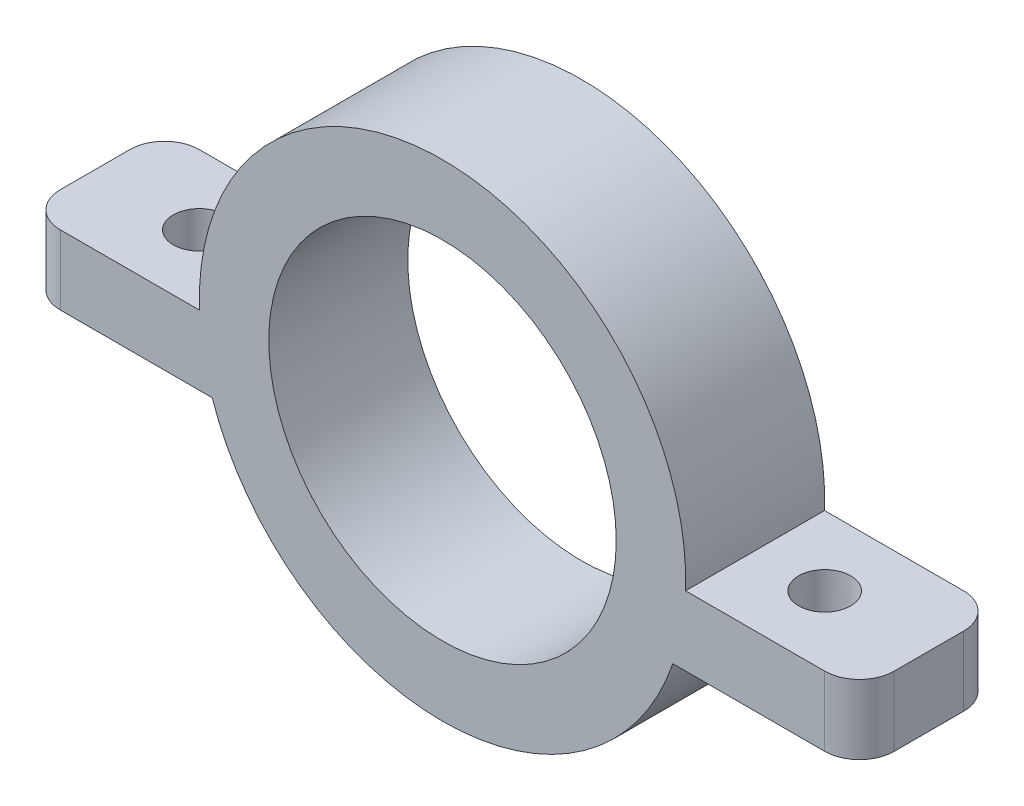
ISO-10303-21;
HEADER;
FILE_DESCRIPTION(('STEP AP214'),'2;1');
FILE_NAME('part.step','',(''),(''),'','','');
FILE_SCHEMA(('AUTOMOTIVE_DESIGN { 1 0 10303 214 1 1 1 1 }'));
ENDSEC;
DATA;
#1=APPLICATION_CONTEXT('core data for automotive mechanical design processes');
#2=APPLICATION_PROTOCOL_DEFINITION('international standard','automotive_design',2000,#1);
#3=PRODUCT_CONTEXT('',#1,'mechanical');
#4=PRODUCT('Part','Part','',(#3));
#5=PRODUCT_RELATED_PRODUCT_CATEGORY('part','',(#4));
#6=PRODUCT_DEFINITION_FORMATION('','',#4);
#7=PRODUCT_DEFINITION_CONTEXT('part definition',#1,'design');
#8=PRODUCT_DEFINITION('design','',#6,#7);
#9=PRODUCT_DEFINITION_SHAPE('','',#8);
#10=(LENGTH_UNIT() NAMED_UNIT(*) SI_UNIT(.MILLI.,.METRE.));
#11=(NAMED_UNIT(*) PLANE_ANGLE_UNIT() SI_UNIT($,.RADIAN.));
#12=(NAMED_UNIT(*) SI_UNIT($,.STERADIAN.) SOLID_ANGLE_UNIT());
#13=UNCERTAINTY_MEASURE_WITH_UNIT(LENGTH_MEASURE(1.E-05),#10,'distance_accuracy_value','');
#14=(GEOMETRIC_REPRESENTATION_CONTEXT(3) GLOBAL_UNCERTAINTY_ASSIGNED_CONTEXT((#13)) GLOBAL_UNIT_ASSIGNED_CONTEXT((#10,
#11,#12)) REPRESENTATION_CONTEXT('',''));
#15=CARTESIAN_POINT('',(0.,0.,0.));
#16=DIRECTION('',(0.,0.,1.));
#17=DIRECTION('',(1.,0.,0.));
#18=AXIS2_PLACEMENT_3D('',#15,#16,#17);
#19=CARTESIAN_POINT('',(-24.,-0.5,8.));
#20=DIRECTION('',(0.,1.,0.));
#21=DIRECTION('',(0.,0.,1.));
#22=AXIS2_PLACEMENT_3D('',#19,#20,#21);
#23=PLANE('',#22);
#24=CARTESIAN_POINT('',(-17.9955342898166,-0.5,4.));
#25=DIRECTION('',(0.,1.,0.));
#26=DIRECTION('',(0.,0.,1.));
#27=AXIS2_PLACEMENT_3D('',#24,#25,#26);
#28=CIRCLE('',#27,1.5);
#29=CARTESIAN_POINT('',(-17.9955342898166,-0.5,5.5));
#30=VERTEX_POINT('',#29);
#31=EDGE_CURVE('E316',#30,#30,#28,.T.);
#32=ORIENTED_EDGE('',*,*,#31,.F.);
#33=EDGE_LOOP('',(#32));
#34=FACE_BOUND('',#33,.T.);
#35=DIRECTION('',(1.,0.,0.));
#36=VECTOR('',#35,1.);
#37=CARTESIAN_POINT('',(-24.,-0.5,0.));
#38=LINE('',#37,#36);
#39=CARTESIAN_POINT('',(-22.,-0.5,0.));
#40=VERTEX_POINT('',#39);
#41=CARTESIAN_POINT('',(-13.9910685796332,-0.500000000000002,0.));
#42=VERTEX_POINT('',#41);
#43=EDGE_CURVE('E158',#40,#42,#38,.T.);
#44=ORIENTED_EDGE('',*,*,#43,.F.);
#45=CARTESIAN_POINT('',(-22.,-0.5,2.));
#46=DIRECTION('',(0.,1.,0.));
#47=DIRECTION('',(0.,0.,1.));
#48=AXIS2_PLACEMENT_3D('',#45,#46,#47);
#49=CIRCLE('',#48,2.);
#50=CARTESIAN_POINT('',(-24.,-0.5,2.));
#51=VERTEX_POINT('',#50);
#52=EDGE_CURVE('E11',#40,#51,#49,.T.);
#53=ORIENTED_EDGE('',*,*,#52,.T.);
#54=DIRECTION('',(0.,0.,-1.));
#55=VECTOR('',#54,1.);
#56=CARTESIAN_POINT('',(-24.,-0.5,8.));
#57=LINE('',#56,#55);
#58=CARTESIAN_POINT('',(-24.,-0.5,6.));
#59=VERTEX_POINT('',#58);
#60=EDGE_CURVE('E170',#59,#51,#57,.T.);
#61=ORIENTED_EDGE('',*,*,#60,.F.);
#62=CARTESIAN_POINT('',(-22.,-0.5,6.));
#63=DIRECTION('',(0.,1.,0.));
#64=DIRECTION('',(0.,0.,1.));
#65=AXIS2_PLACEMENT_3D('',#62,#63,#64);
#66=CIRCLE('',#65,2.);
#67=CARTESIAN_POINT('',(-22.,-0.5,8.));
#68=VERTEX_POINT('',#67);
#69=EDGE_CURVE('E42',#59,#68,#66,.T.);
#70=ORIENTED_EDGE('',*,*,#69,.T.);
#71=DIRECTION('',(1.,0.,0.));
#72=VECTOR('',#71,1.);
#73=CARTESIAN_POINT('',(-24.,-0.5,8.));
#74=LINE('',#73,#72);
#75=CARTESIAN_POINT('',(-13.9910685796332,-0.500000000000002,8.));
#76=VERTEX_POINT('',#75);
#77=EDGE_CURVE('E122',#68,#76,#74,.T.);
#78=ORIENTED_EDGE('',*,*,#77,.T.);
#79=DIRECTION('',(0.,0.,-1.));
#80=VECTOR('',#79,1.);
#81=CARTESIAN_POINT('',(-13.9910685796332,-0.500000000000002,8.));
#82=LINE('',#81,#80);
#83=EDGE_CURVE('E124',#76,#42,#82,.T.);
#84=ORIENTED_EDGE('',*,*,#83,.T.);
#85=EDGE_LOOP('',(#44,#53,#61,#70,#78,#84));
#86=FACE_BOUND('',#85,.T.);
#87=ADVANCED_FACE('F33',(#34,#86),#23,.T.);
#88=CARTESIAN_POINT('',(-24.,-0.5,8.));
#89=DIRECTION('',(1.,0.,0.));
#90=DIRECTION('',(0.,0.,-1.));
#91=AXIS2_PLACEMENT_3D('',#88,#89,#90);
#92=PLANE('',#91);
#93=ORIENTED_EDGE('',*,*,#60,.T.);
#94=DIRECTION('',(0.,-1.,0.));
#95=VECTOR('',#94,1.);
#96=CARTESIAN_POINT('',(-24.,-4.5,2.));
#97=LINE('',#96,#95);
#98=CARTESIAN_POINT('',(-24.,-4.5,2.));
#99=VERTEX_POINT('',#98);
#100=EDGE_CURVE('E211',#51,#99,#97,.T.);
#101=ORIENTED_EDGE('',*,*,#100,.T.);
#102=DIRECTION('',(0.,0.,-1.));
#103=VECTOR('',#102,1.);
#104=CARTESIAN_POINT('',(-24.,-4.5,8.));
#105=LINE('',#104,#103);
#106=CARTESIAN_POINT('',(-24.,-4.5,6.));
#107=VERTEX_POINT('',#106);
#108=EDGE_CURVE('E173',#107,#99,#105,.T.);
#109=ORIENTED_EDGE('',*,*,#108,.F.);
#110=DIRECTION('',(0.,-1.,0.));
#111=VECTOR('',#110,1.);
#112=CARTESIAN_POINT('',(-24.,-0.5,6.));
#113=LINE('',#112,#111);
#114=EDGE_CURVE('E54',#107,#59,#113,.F.);
#115=ORIENTED_EDGE('',*,*,#114,.T.);
#116=EDGE_LOOP('',(#93,#101,#109,#115));
#117=FACE_BOUND('',#116,.T.);
#118=ADVANCED_FACE('F230',(#117),#92,.F.);
#119=CARTESIAN_POINT('',(-24.,-4.5,8.));
#120=DIRECTION('',(0.,1.,0.));
#121=DIRECTION('',(0.,0.,1.));
#122=AXIS2_PLACEMENT_3D('',#119,#120,#121);
#123=PLANE('',#122);
#124=CARTESIAN_POINT('',(-17.9955342898166,-4.5,4.));
#125=DIRECTION('',(0.,1.,0.));
#126=DIRECTION('',(0.,0.,1.));
#127=AXIS2_PLACEMENT_3D('',#124,#125,#126);
#128=CIRCLE('',#127,1.5);
#129=CARTESIAN_POINT('',(-17.9955342898166,-4.5,5.5));
#130=VERTEX_POINT('',#129);
#131=EDGE_CURVE('E37',#130,#130,#128,.T.);
#132=ORIENTED_EDGE('',*,*,#131,.T.);
#133=EDGE_LOOP('',(#132));
#134=FACE_BOUND('',#133,.T.);
#135=ORIENTED_EDGE('',*,*,#108,.T.);
#136=CARTESIAN_POINT('',(-22.,-4.5,2.));
#137=DIRECTION('',(0.,1.,0.));
#138=DIRECTION('',(0.,0.,1.));
#139=AXIS2_PLACEMENT_3D('',#136,#137,#138);
#140=CIRCLE('',#139,2.);
#141=CARTESIAN_POINT('',(-22.,-4.5,0.));
#142=VERTEX_POINT('',#141);
#143=EDGE_CURVE('E216',#99,#142,#140,.F.);
#144=ORIENTED_EDGE('',*,*,#143,.T.);
#145=DIRECTION('',(1.,0.,0.));
#146=VECTOR('',#145,1.);
#147=CARTESIAN_POINT('',(-24.,-4.5,0.));
#148=LINE('',#147,#146);
#149=CARTESIAN_POINT('',(-13.2570735835629,-4.5,0.));
#150=VERTEX_POINT('',#149);
#151=EDGE_CURVE('E132',#142,#150,#148,.T.);
#152=ORIENTED_EDGE('',*,*,#151,.T.);
#153=DIRECTION('',(0.,0.,-1.));
#154=VECTOR('',#153,1.);
#155=CARTESIAN_POINT('',(-13.2570735835629,-4.5,8.));
#156=LINE('',#155,#154);
#157=CARTESIAN_POINT('',(-13.2570735835629,-4.5,8.));
#158=VERTEX_POINT('',#157);
#159=EDGE_CURVE('E176',#158,#150,#156,.T.);
#160=ORIENTED_EDGE('',*,*,#159,.F.);
#161=DIRECTION('',(1.,0.,0.));
#162=VECTOR('',#161,1.);
#163=CARTESIAN_POINT('',(-24.,-4.5,8.));
#164=LINE('',#163,#162);
#165=CARTESIAN_POINT('',(-22.,-4.5,8.));
#166=VERTEX_POINT('',#165);
#167=EDGE_CURVE('E141',#166,#158,#164,.T.);
#168=ORIENTED_EDGE('',*,*,#167,.F.);
#169=CARTESIAN_POINT('',(-22.,-4.5,6.));
#170=DIRECTION('',(0.,1.,0.));
#171=DIRECTION('',(0.,0.,1.));
#172=AXIS2_PLACEMENT_3D('',#169,#170,#171);
#173=CIRCLE('',#172,2.);
#174=EDGE_CURVE('E214',#166,#107,#173,.F.);
#175=ORIENTED_EDGE('',*,*,#174,.T.);
#176=EDGE_LOOP('',(#135,#144,#152,#160,#168,#175));
#177=FACE_BOUND('',#176,.T.);
#178=ADVANCED_FACE('F220',(#134,#177),#123,.F.);
#179=CARTESIAN_POINT('',(0.,0.,8.));
#180=DIRECTION('',(0.,0.,-1.));
#181=DIRECTION('',(-1.,0.,0.));
#182=AXIS2_PLACEMENT_3D('',#179,#180,#181);
#183=CYLINDRICAL_SURFACE('',#182,14.);
#184=CARTESIAN_POINT('',(0.,0.,0.));
#185=DIRECTION('',(0.,0.,1.));
#186=DIRECTION('',(1.,0.,0.));
#187=AXIS2_PLACEMENT_3D('',#184,#185,#186);
#188=CIRCLE('',#187,14.);
#189=CARTESIAN_POINT('',(13.2570735835628,-4.50000000000001,0.));
#190=VERTEX_POINT('',#189);
#191=EDGE_CURVE('E166',#150,#190,#188,.T.);
#192=ORIENTED_EDGE('',*,*,#191,.T.);
#193=DIRECTION('',(0.,0.,-1.));
#194=VECTOR('',#193,1.);
#195=CARTESIAN_POINT('',(13.2570735835628,-4.50000000000001,8.));
#196=LINE('',#195,#194);
#197=CARTESIAN_POINT('',(13.2570735835628,-4.50000000000001,8.));
#198=VERTEX_POINT('',#197);
#199=EDGE_CURVE('E179',#198,#190,#196,.T.);
#200=ORIENTED_EDGE('',*,*,#199,.F.);
#201=CARTESIAN_POINT('',(0.,0.,8.));
#202=DIRECTION('',(0.,0.,1.));
#203=DIRECTION('',(1.,0.,0.));
#204=AXIS2_PLACEMENT_3D('',#201,#202,#203);
#205=CIRCLE('',#204,14.);
#206=EDGE_CURVE('E154',#158,#198,#205,.T.);
#207=ORIENTED_EDGE('',*,*,#206,.F.);
#208=ORIENTED_EDGE('',*,*,#159,.T.);
#209=EDGE_LOOP('',(#192,#200,#207,#208));
#210=FACE_BOUND('',#209,.T.);
#211=ADVANCED_FACE('F236',(#210),#183,.T.);
#212=CARTESIAN_POINT('',(24.,-4.5,8.));
#213=DIRECTION('',(0.,-1.,0.));
#214=DIRECTION('',(0.,0.,-1.));
#215=AXIS2_PLACEMENT_3D('',#212,#213,#214);
#216=PLANE('',#215);
#217=CARTESIAN_POINT('',(17.9955342898166,-4.5,4.));
#218=DIRECTION('',(0.,-1.,0.));
#219=DIRECTION('',(0.,0.,-1.));
#220=AXIS2_PLACEMENT_3D('',#217,#218,#219);
#221=CIRCLE('',#220,1.5);
#222=CARTESIAN_POINT('',(17.9955342898166,-4.5,2.5));
#223=VERTEX_POINT('',#222);
#224=EDGE_CURVE('E318',#223,#223,#221,.T.);
#225=ORIENTED_EDGE('',*,*,#224,.F.);
#226=EDGE_LOOP('',(#225));
#227=FACE_BOUND('',#226,.T.);
#228=DIRECTION('',(0.,0.,-1.));
#229=VECTOR('',#228,1.);
#230=CARTESIAN_POINT('',(24.,-4.5,8.));
#231=LINE('',#230,#229);
#232=CARTESIAN_POINT('',(24.,-4.5,6.));
#233=VERTEX_POINT('',#232);
#234=CARTESIAN_POINT('',(24.,-4.5,2.));
#235=VERTEX_POINT('',#234);
#236=EDGE_CURVE('E182',#233,#235,#231,.T.);
#237=ORIENTED_EDGE('',*,*,#236,.F.);
#238=CARTESIAN_POINT('',(22.,-4.5,6.));
#239=DIRECTION('',(0.,-1.,0.));
#240=DIRECTION('',(0.,0.,-1.));
#241=AXIS2_PLACEMENT_3D('',#238,#239,#240);
#242=CIRCLE('',#241,2.);
#243=CARTESIAN_POINT('',(22.,-4.5,8.));
#244=VERTEX_POINT('',#243);
#245=EDGE_CURVE('E195',#233,#244,#242,.T.);
#246=ORIENTED_EDGE('',*,*,#245,.T.);
#247=DIRECTION('',(-1.,0.,0.));
#248=VECTOR('',#247,1.);
#249=CARTESIAN_POINT('',(24.,-4.5,8.));
#250=LINE('',#249,#248);
#251=EDGE_CURVE('E149',#244,#198,#250,.T.);
#252=ORIENTED_EDGE('',*,*,#251,.T.);
#253=ORIENTED_EDGE('',*,*,#199,.T.);
#254=DIRECTION('',(-1.,0.,0.));
#255=VECTOR('',#254,1.);
#256=CARTESIAN_POINT('',(24.,-4.5,0.));
#257=LINE('',#256,#255);
#258=CARTESIAN_POINT('',(22.,-4.5,0.));
#259=VERTEX_POINT('',#258);
#260=EDGE_CURVE('E164',#259,#190,#257,.T.);
#261=ORIENTED_EDGE('',*,*,#260,.F.);
#262=CARTESIAN_POINT('',(22.,-4.5,2.));
#263=DIRECTION('',(0.,-1.,0.));
#264=DIRECTION('',(0.,0.,-1.));
#265=AXIS2_PLACEMENT_3D('',#262,#263,#264);
#266=CIRCLE('',#265,2.);
#267=EDGE_CURVE('E193',#259,#235,#266,.T.);
#268=ORIENTED_EDGE('',*,*,#267,.T.);
#269=EDGE_LOOP('',(#237,#246,#252,#253,#261,#268));
#270=FACE_BOUND('',#269,.T.);
#271=ADVANCED_FACE('F255',(#227,#270),#216,.T.);
#272=CARTESIAN_POINT('',(24.,-0.5,8.));
#273=DIRECTION('',(1.,0.,0.));
#274=DIRECTION('',(0.,0.,-1.));
#275=AXIS2_PLACEMENT_3D('',#272,#273,#274);
#276=PLANE('',#275);
#277=DIRECTION('',(0.,0.,-1.));
#278=VECTOR('',#277,1.);
#279=CARTESIAN_POINT('',(24.,-0.5,8.));
#280=LINE('',#279,#278);
#281=CARTESIAN_POINT('',(24.,-0.5,6.));
#282=VERTEX_POINT('',#281);
#283=CARTESIAN_POINT('',(24.,-0.5,2.));
#284=VERTEX_POINT('',#283);
#285=EDGE_CURVE('E185',#282,#284,#280,.T.);
#286=ORIENTED_EDGE('',*,*,#285,.F.);
#287=DIRECTION('',(0.,-1.,0.));
#288=VECTOR('',#287,1.);
#289=CARTESIAN_POINT('',(24.,-4.5,6.));
#290=LINE('',#289,#288);
#291=EDGE_CURVE('E190',#282,#233,#290,.T.);
#292=ORIENTED_EDGE('',*,*,#291,.T.);
#293=ORIENTED_EDGE('',*,*,#236,.T.);
#294=DIRECTION('',(0.,-1.,0.));
#295=VECTOR('',#294,1.);
#296=CARTESIAN_POINT('',(24.,-0.5,2.));
#297=LINE('',#296,#295);
#298=EDGE_CURVE('E172',#235,#284,#297,.F.);
#299=ORIENTED_EDGE('',*,*,#298,.T.);
#300=EDGE_LOOP('',(#286,#292,#293,#299));
#301=FACE_BOUND('',#300,.T.);
#302=ADVANCED_FACE('F248',(#301),#276,.T.);
#303=CARTESIAN_POINT('',(24.,-0.5,8.));
#304=DIRECTION('',(0.,-1.,0.));
#305=DIRECTION('',(0.,0.,-1.));
#306=AXIS2_PLACEMENT_3D('',#303,#304,#305);
#307=PLANE('',#306);
#308=CARTESIAN_POINT('',(17.9955342898166,-0.5,4.));
#309=DIRECTION('',(0.,1.,0.));
#310=DIRECTION('',(0.,0.,1.));
#311=AXIS2_PLACEMENT_3D('',#308,#309,#310);
#312=CIRCLE('',#311,1.5);
#313=CARTESIAN_POINT('',(17.9955342898166,-0.5,5.5));
#314=VERTEX_POINT('',#313);
#315=EDGE_CURVE('E321',#314,#314,#312,.T.);
#316=ORIENTED_EDGE('',*,*,#315,.F.);
#317=EDGE_LOOP('',(#316));
#318=FACE_BOUND('',#317,.T.);
#319=DIRECTION('',(-1.,0.,0.));
#320=VECTOR('',#319,1.);
#321=CARTESIAN_POINT('',(24.,-0.5,8.));
#322=LINE('',#321,#320);
#323=CARTESIAN_POINT('',(22.,-0.5,8.));
#324=VERTEX_POINT('',#323);
#325=CARTESIAN_POINT('',(13.9910685796332,-0.5,8.));
#326=VERTEX_POINT('',#325);
#327=EDGE_CURVE('E146',#324,#326,#322,.T.);
#328=ORIENTED_EDGE('',*,*,#327,.F.);
#329=CARTESIAN_POINT('',(22.,-0.5,6.));
#330=DIRECTION('',(0.,-1.,0.));
#331=DIRECTION('',(0.,0.,-1.));
#332=AXIS2_PLACEMENT_3D('',#329,#330,#331);
#333=CIRCLE('',#332,2.);
#334=EDGE_CURVE('E203',#324,#282,#333,.F.);
#335=ORIENTED_EDGE('',*,*,#334,.T.);
#336=ORIENTED_EDGE('',*,*,#285,.T.);
#337=CARTESIAN_POINT('',(22.,-0.5,2.));
#338=DIRECTION('',(0.,-1.,0.));
#339=DIRECTION('',(0.,0.,-1.));
#340=AXIS2_PLACEMENT_3D('',#337,#338,#339);
#341=CIRCLE('',#340,2.);
#342=CARTESIAN_POINT('',(22.,-0.5,0.));
#343=VERTEX_POINT('',#342);
#344=EDGE_CURVE('E201',#284,#343,#341,.F.);
#345=ORIENTED_EDGE('',*,*,#344,.T.);
#346=DIRECTION('',(-1.,0.,0.));
#347=VECTOR('',#346,1.);
#348=CARTESIAN_POINT('',(24.,-0.5,0.));
#349=LINE('',#348,#347);
#350=CARTESIAN_POINT('',(13.9910685796332,-0.5,0.));
#351=VERTEX_POINT('',#350);
#352=EDGE_CURVE('E162',#343,#351,#349,.T.);
#353=ORIENTED_EDGE('',*,*,#352,.T.);
#354=DIRECTION('',(0.,0.,-1.));
#355=VECTOR('',#354,1.);
#356=CARTESIAN_POINT('',(13.9910685796332,-0.5,8.));
#357=LINE('',#356,#355);
#358=EDGE_CURVE('E140',#326,#351,#357,.T.);
#359=ORIENTED_EDGE('',*,*,#358,.F.);
#360=EDGE_LOOP('',(#328,#335,#336,#345,#353,#359));
#361=FACE_BOUND('',#360,.T.);
#362=ADVANCED_FACE('F245',(#318,#361),#307,.F.);
#363=CARTESIAN_POINT('',(0.,0.,8.));
#364=DIRECTION('',(0.,0.,-1.));
#365=DIRECTION('',(-1.,0.,0.));
#366=AXIS2_PLACEMENT_3D('',#363,#364,#365);
#367=CYLINDRICAL_SURFACE('',#366,14.);
#368=CARTESIAN_POINT('',(0.,0.,0.));
#369=DIRECTION('',(0.,0.,-1.));
#370=DIRECTION('',(-1.,0.,0.));
#371=AXIS2_PLACEMENT_3D('',#368,#369,#370);
#372=CIRCLE('',#371,14.);
#373=EDGE_CURVE('E139',#42,#351,#372,.T.);
#374=ORIENTED_EDGE('',*,*,#373,.F.);
#375=ORIENTED_EDGE('',*,*,#83,.F.);
#376=CARTESIAN_POINT('',(0.,0.,8.));
#377=DIRECTION('',(0.,0.,-1.));
#378=DIRECTION('',(-1.,0.,0.));
#379=AXIS2_PLACEMENT_3D('',#376,#377,#378);
#380=CIRCLE('',#379,14.);
#381=EDGE_CURVE('E131',#76,#326,#380,.T.);
#382=ORIENTED_EDGE('',*,*,#381,.T.);
#383=ORIENTED_EDGE('',*,*,#358,.T.);
#384=EDGE_LOOP('',(#374,#375,#382,#383));
#385=FACE_BOUND('',#384,.T.);
#386=ADVANCED_FACE('F136',(#385),#367,.T.);
#387=CARTESIAN_POINT('',(0.,0.,8.));
#388=DIRECTION('',(0.,0.,-1.));
#389=DIRECTION('',(-1.,0.,0.));
#390=AXIS2_PLACEMENT_3D('',#387,#388,#389);
#391=PLANE('',#390);
#392=CARTESIAN_POINT('',(0.,0.,8.));
#393=DIRECTION('',(0.,0.,1.));
#394=DIRECTION('',(1.,0.,0.));
#395=AXIS2_PLACEMENT_3D('',#392,#393,#394);
#396=CIRCLE('',#395,10.);
#397=CARTESIAN_POINT('',(10.,0.,8.));
#398=VERTEX_POINT('',#397);
#399=EDGE_CURVE('E315',#398,#398,#396,.T.);
#400=ORIENTED_EDGE('',*,*,#399,.F.);
#401=EDGE_LOOP('',(#400));
#402=FACE_BOUND('',#401,.T.);
#403=ORIENTED_EDGE('',*,*,#251,.F.);
#404=DIRECTION('',(0.,-1.,0.));
#405=VECTOR('',#404,1.);
#406=CARTESIAN_POINT('',(22.,-0.5,8.));
#407=LINE('',#406,#405);
#408=EDGE_CURVE('E199',#244,#324,#407,.F.);
#409=ORIENTED_EDGE('',*,*,#408,.T.);
#410=ORIENTED_EDGE('',*,*,#327,.T.);
#411=ORIENTED_EDGE('',*,*,#381,.F.);
#412=ORIENTED_EDGE('',*,*,#77,.F.);
#413=DIRECTION('',(0.,-1.,0.));
#414=VECTOR('',#413,1.);
#415=CARTESIAN_POINT('',(-22.,0.,8.));
#416=LINE('',#415,#414);
#417=EDGE_CURVE('E197',#68,#166,#416,.T.);
#418=ORIENTED_EDGE('',*,*,#417,.T.);
#419=ORIENTED_EDGE('',*,*,#167,.T.);
#420=ORIENTED_EDGE('',*,*,#206,.T.);
#421=EDGE_LOOP('',(#403,#409,#410,#411,#412,#418,#419,#420));
#422=FACE_BOUND('',#421,.T.);
#423=ADVANCED_FACE('F144',(#402,#422),#391,.F.);
#424=CARTESIAN_POINT('',(0.,0.,0.));
#425=DIRECTION('',(0.,0.,-1.));
#426=DIRECTION('',(-1.,0.,0.));
#427=AXIS2_PLACEMENT_3D('',#424,#425,#426);
#428=PLANE('',#427);
#429=CARTESIAN_POINT('',(0.,0.,0.));
#430=DIRECTION('',(0.,0.,1.));
#431=DIRECTION('',(1.,0.,0.));
#432=AXIS2_PLACEMENT_3D('',#429,#430,#431);
#433=CIRCLE('',#432,10.);
#434=CARTESIAN_POINT('',(10.,0.,0.));
#435=VERTEX_POINT('',#434);
#436=EDGE_CURVE('E160',#435,#435,#433,.T.);
#437=ORIENTED_EDGE('',*,*,#436,.T.);
#438=EDGE_LOOP('',(#437));
#439=FACE_BOUND('',#438,.T.);
#440=ORIENTED_EDGE('',*,*,#352,.F.);
#441=DIRECTION('',(0.,-1.,0.));
#442=VECTOR('',#441,1.);
#443=CARTESIAN_POINT('',(22.,0.,0.));
#444=LINE('',#443,#442);
#445=EDGE_CURVE('E207',#343,#259,#444,.T.);
#446=ORIENTED_EDGE('',*,*,#445,.T.);
#447=ORIENTED_EDGE('',*,*,#260,.T.);
#448=ORIENTED_EDGE('',*,*,#191,.F.);
#449=ORIENTED_EDGE('',*,*,#151,.F.);
#450=DIRECTION('',(0.,-1.,0.));
#451=VECTOR('',#450,1.);
#452=CARTESIAN_POINT('',(-22.,-0.5,0.));
#453=LINE('',#452,#451);
#454=EDGE_CURVE('E205',#142,#40,#453,.F.);
#455=ORIENTED_EDGE('',*,*,#454,.T.);
#456=ORIENTED_EDGE('',*,*,#43,.T.);
#457=ORIENTED_EDGE('',*,*,#373,.T.);
#458=EDGE_LOOP('',(#440,#446,#447,#448,#449,#455,#456,#457));
#459=FACE_BOUND('',#458,.T.);
#460=ADVANCED_FACE('F228',(#439,#459),#428,.T.);
#461=CARTESIAN_POINT('',(0.,0.,0.));
#462=DIRECTION('',(0.,0.,1.));
#463=DIRECTION('',(1.,0.,0.));
#464=AXIS2_PLACEMENT_3D('',#461,#462,#463);
#465=CYLINDRICAL_SURFACE('',#464,10.);
#466=ORIENTED_EDGE('',*,*,#436,.F.);
#467=EDGE_LOOP('',(#466));
#468=FACE_BOUND('',#467,.T.);
#469=ORIENTED_EDGE('',*,*,#399,.T.);
#470=EDGE_LOOP('',(#469));
#471=FACE_BOUND('',#470,.T.);
#472=ADVANCED_FACE('F279',(#468,#471),#465,.F.);
#473=CARTESIAN_POINT('',(22.,-0.5,6.));
#474=DIRECTION('',(0.,1.,0.));
#475=DIRECTION('',(0.,0.,1.));
#476=AXIS2_PLACEMENT_3D('',#473,#474,#475);
#477=CYLINDRICAL_SURFACE('',#476,2.);
#478=ORIENTED_EDGE('',*,*,#334,.F.);
#479=ORIENTED_EDGE('',*,*,#408,.F.);
#480=ORIENTED_EDGE('',*,*,#245,.F.);
#481=ORIENTED_EDGE('',*,*,#291,.F.);
#482=EDGE_LOOP('',(#478,#479,#480,#481));
#483=FACE_BOUND('',#482,.T.);
#484=ADVANCED_FACE('F241',(#483),#477,.T.);
#485=CARTESIAN_POINT('',(22.,0.,2.));
#486=DIRECTION('',(0.,-1.,0.));
#487=DIRECTION('',(0.,0.,-1.));
#488=AXIS2_PLACEMENT_3D('',#485,#486,#487);
#489=CYLINDRICAL_SURFACE('',#488,2.);
#490=ORIENTED_EDGE('',*,*,#344,.F.);
#491=ORIENTED_EDGE('',*,*,#298,.F.);
#492=ORIENTED_EDGE('',*,*,#267,.F.);
#493=ORIENTED_EDGE('',*,*,#445,.F.);
#494=EDGE_LOOP('',(#490,#491,#492,#493));
#495=FACE_BOUND('',#494,.T.);
#496=ADVANCED_FACE('F252',(#495),#489,.T.);
#497=CARTESIAN_POINT('',(-22.,-0.5,2.));
#498=DIRECTION('',(0.,1.,0.));
#499=DIRECTION('',(0.,0.,1.));
#500=AXIS2_PLACEMENT_3D('',#497,#498,#499);
#501=CYLINDRICAL_SURFACE('',#500,2.);
#502=ORIENTED_EDGE('',*,*,#52,.F.);
#503=ORIENTED_EDGE('',*,*,#454,.F.);
#504=ORIENTED_EDGE('',*,*,#143,.F.);
#505=ORIENTED_EDGE('',*,*,#100,.F.);
#506=EDGE_LOOP('',(#502,#503,#504,#505));
#507=FACE_BOUND('',#506,.T.);
#508=ADVANCED_FACE('F229',(#507),#501,.T.);
#509=CARTESIAN_POINT('',(-22.,0.,6.));
#510=DIRECTION('',(0.,-1.,0.));
#511=DIRECTION('',(0.,0.,-1.));
#512=AXIS2_PLACEMENT_3D('',#509,#510,#511);
#513=CYLINDRICAL_SURFACE('',#512,2.);
#514=ORIENTED_EDGE('',*,*,#69,.F.);
#515=ORIENTED_EDGE('',*,*,#114,.F.);
#516=ORIENTED_EDGE('',*,*,#174,.F.);
#517=ORIENTED_EDGE('',*,*,#417,.F.);
#518=EDGE_LOOP('',(#514,#515,#516,#517));
#519=FACE_BOUND('',#518,.T.);
#520=ADVANCED_FACE('F35',(#519),#513,.T.);
#521=CARTESIAN_POINT('',(-17.9955342898166,-14.,4.));
#522=DIRECTION('',(0.,1.,0.));
#523=DIRECTION('',(0.,0.,1.));
#524=AXIS2_PLACEMENT_3D('',#521,#522,#523);
#525=CYLINDRICAL_SURFACE('',#524,1.5);
#526=ORIENTED_EDGE('',*,*,#31,.T.);
#527=EDGE_LOOP('',(#526));
#528=FACE_BOUND('',#527,.T.);
#529=ORIENTED_EDGE('',*,*,#131,.F.);
#530=EDGE_LOOP('',(#529));
#531=FACE_BOUND('',#530,.T.);
#532=ADVANCED_FACE('F285',(#528,#531),#525,.F.);
#533=CARTESIAN_POINT('',(17.9955342898166,-14.,4.));
#534=DIRECTION('',(0.,1.,0.));
#535=DIRECTION('',(0.,0.,1.));
#536=AXIS2_PLACEMENT_3D('',#533,#534,#535);
#537=CYLINDRICAL_SURFACE('',#536,1.5);
#538=ORIENTED_EDGE('',*,*,#224,.T.);
#539=EDGE_LOOP('',(#538));
#540=FACE_BOUND('',#539,.T.);
#541=ORIENTED_EDGE('',*,*,#315,.T.);
#542=EDGE_LOOP('',(#541));
#543=FACE_BOUND('',#542,.T.);
#544=ADVANCED_FACE('F289',(#540,#543),#537,.F.);
#545=CLOSED_SHELL('',(#87,#118,#178,#211,#271,#302,#362,#386,#423,#460,#472,#484,#496,#508,#520,
#532,#544));
#546=MANIFOLD_SOLID_BREP('B2',#545);
#547=ADVANCED_BREP_SHAPE_REPRESENTATION('',(#18,#546),#14);
#548=SHAPE_DEFINITION_REPRESENTATION(#9,#547);
ENDSEC;
END-ISO-10303-21;
